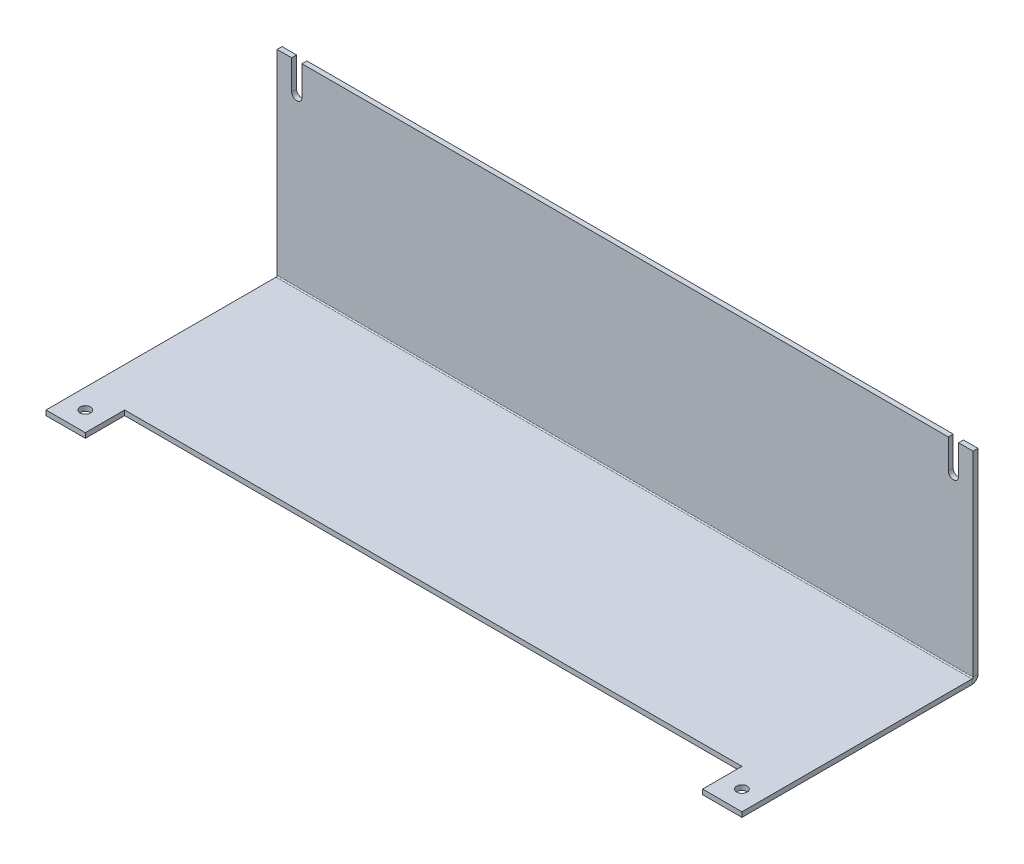
ISO-10303-21;
HEADER;
FILE_DESCRIPTION(('STEP AP214'),'2;1');
FILE_NAME('part.step','',(''),(''),'','','');
FILE_SCHEMA(('AUTOMOTIVE_DESIGN { 1 0 10303 214 1 1 1 1 }'));
ENDSEC;
DATA;
#1=APPLICATION_CONTEXT('core data for automotive mechanical design processes');
#2=APPLICATION_PROTOCOL_DEFINITION('international standard','automotive_design',2000,#1);
#3=PRODUCT_CONTEXT('',#1,'mechanical');
#4=PRODUCT('Part','Part','',(#3));
#5=PRODUCT_RELATED_PRODUCT_CATEGORY('part','',(#4));
#6=PRODUCT_DEFINITION_FORMATION('','',#4);
#7=PRODUCT_DEFINITION_CONTEXT('part definition',#1,'design');
#8=PRODUCT_DEFINITION('design','',#6,#7);
#9=PRODUCT_DEFINITION_SHAPE('','',#8);
#10=(LENGTH_UNIT() NAMED_UNIT(*) SI_UNIT(.MILLI.,.METRE.));
#11=(NAMED_UNIT(*) PLANE_ANGLE_UNIT() SI_UNIT($,.RADIAN.));
#12=(NAMED_UNIT(*) SI_UNIT($,.STERADIAN.) SOLID_ANGLE_UNIT());
#13=UNCERTAINTY_MEASURE_WITH_UNIT(LENGTH_MEASURE(1.E-05),#10,'distance_accuracy_value','');
#14=(GEOMETRIC_REPRESENTATION_CONTEXT(3) GLOBAL_UNCERTAINTY_ASSIGNED_CONTEXT((#13)) GLOBAL_UNIT_ASSIGNED_CONTEXT((#10,
#11,#12)) REPRESENTATION_CONTEXT('',''));
#15=CARTESIAN_POINT('',(0.,0.,0.));
#16=DIRECTION('',(0.,0.,1.));
#17=DIRECTION('',(1.,0.,0.));
#18=AXIS2_PLACEMENT_3D('',#15,#16,#17);
#19=CARTESIAN_POINT('',(0.,-3.175,0.));
#20=DIRECTION('',(0.,0.,1.));
#21=DIRECTION('',(1.,0.,0.));
#22=AXIS2_PLACEMENT_3D('',#19,#20,#21);
#23=PLANE('',#22);
#24=DIRECTION('',(1.,0.,0.));
#25=VECTOR('',#24,1.);
#26=CARTESIAN_POINT('',(0.,0.,0.));
#27=LINE('',#26,#25);
#28=CARTESIAN_POINT('',(25.4,0.,0.));
#29=VERTEX_POINT('',#28);
#30=CARTESIAN_POINT('',(423.926,0.,0.));
#31=VERTEX_POINT('',#30);
#32=EDGE_CURVE('E77',#29,#31,#27,.T.);
#33=ORIENTED_EDGE('',*,*,#32,.F.);
#34=DIRECTION('',(0.,1.,0.));
#35=VECTOR('',#34,1.);
#36=CARTESIAN_POINT('',(25.4,0.,0.));
#37=LINE('',#36,#35);
#38=CARTESIAN_POINT('',(25.4,-3.175,0.));
#39=VERTEX_POINT('',#38);
#40=EDGE_CURVE('E218',#39,#29,#37,.T.);
#41=ORIENTED_EDGE('',*,*,#40,.F.);
#42=DIRECTION('',(1.,0.,0.));
#43=VECTOR('',#42,1.);
#44=CARTESIAN_POINT('',(0.,-3.175,0.));
#45=LINE('',#44,#43);
#46=CARTESIAN_POINT('',(423.926,-3.175,0.));
#47=VERTEX_POINT('',#46);
#48=EDGE_CURVE('E203',#39,#47,#45,.T.);
#49=ORIENTED_EDGE('',*,*,#48,.T.);
#50=DIRECTION('',(0.,-1.,0.));
#51=VECTOR('',#50,1.);
#52=CARTESIAN_POINT('',(423.926,0.,0.));
#53=LINE('',#52,#51);
#54=EDGE_CURVE('E229',#31,#47,#53,.T.);
#55=ORIENTED_EDGE('',*,*,#54,.F.);
#56=EDGE_LOOP('',(#33,#41,#49,#55));
#57=FACE_BOUND('',#56,.T.);
#58=ADVANCED_FACE('F55',(#57),#23,.T.);
#59=CARTESIAN_POINT('',(449.326,127.,-127.));
#60=DIRECTION('',(0.,-1.,0.));
#61=DIRECTION('',(0.,0.,-1.));
#62=AXIS2_PLACEMENT_3D('',#59,#60,#61);
#63=PLANE('',#62);
#64=DIRECTION('',(1.,0.,0.));
#65=VECTOR('',#64,1.);
#66=CARTESIAN_POINT('',(0.,127.,-127.));
#67=LINE('',#66,#65);
#68=CARTESIAN_POINT('',(16.002,127.,-127.));
#69=VERTEX_POINT('',#68);
#70=CARTESIAN_POINT('',(433.324,127.,-127.));
#71=VERTEX_POINT('',#70);
#72=EDGE_CURVE('E285',#69,#71,#67,.T.);
#73=ORIENTED_EDGE('',*,*,#72,.F.);
#74=DIRECTION('',(0.,0.,1.));
#75=VECTOR('',#74,1.);
#76=CARTESIAN_POINT('',(16.002,127.,-127.));
#77=LINE('',#76,#75);
#78=CARTESIAN_POINT('',(16.002,127.,-123.825));
#79=VERTEX_POINT('',#78);
#80=EDGE_CURVE('E64',#69,#79,#77,.T.);
#81=ORIENTED_EDGE('',*,*,#80,.T.);
#82=DIRECTION('',(-1.,0.,0.));
#83=VECTOR('',#82,1.);
#84=CARTESIAN_POINT('',(449.326,127.,-123.825));
#85=LINE('',#84,#83);
#86=CARTESIAN_POINT('',(433.324,127.,-123.825));
#87=VERTEX_POINT('',#86);
#88=EDGE_CURVE('E283',#79,#87,#85,.F.);
#89=ORIENTED_EDGE('',*,*,#88,.T.);
#90=DIRECTION('',(0.,0.,-1.));
#91=VECTOR('',#90,1.);
#92=CARTESIAN_POINT('',(433.324,127.,-127.));
#93=LINE('',#92,#91);
#94=EDGE_CURVE('E267',#87,#71,#93,.T.);
#95=ORIENTED_EDGE('',*,*,#94,.T.);
#96=EDGE_LOOP('',(#73,#81,#89,#95));
#97=FACE_BOUND('',#96,.T.);
#98=ADVANCED_FACE('F282',(#97),#63,.F.);
#99=CARTESIAN_POINT('',(439.928,127.,-127.));
#100=VERTEX_POINT('',#99);
#101=CARTESIAN_POINT('',(449.326,127.,-127.));
#102=VERTEX_POINT('',#101);
#103=EDGE_CURVE('E434',#100,#102,#67,.T.);
#104=ORIENTED_EDGE('',*,*,#103,.F.);
#105=DIRECTION('',(0.,0.,1.));
#106=VECTOR('',#105,1.);
#107=CARTESIAN_POINT('',(439.928,127.,-127.));
#108=LINE('',#107,#106);
#109=CARTESIAN_POINT('',(439.928,127.,-123.825));
#110=VERTEX_POINT('',#109);
#111=EDGE_CURVE('E270',#100,#110,#108,.T.);
#112=ORIENTED_EDGE('',*,*,#111,.T.);
#113=CARTESIAN_POINT('',(449.326,127.,-123.825));
#114=VERTEX_POINT('',#113);
#115=EDGE_CURVE('E298',#110,#114,#85,.F.);
#116=ORIENTED_EDGE('',*,*,#115,.T.);
#117=DIRECTION('',(0.,0.,1.));
#118=VECTOR('',#117,1.);
#119=CARTESIAN_POINT('',(449.326,127.,-127.));
#120=LINE('',#119,#118);
#121=EDGE_CURVE('E430',#102,#114,#120,.T.);
#122=ORIENTED_EDGE('',*,*,#121,.F.);
#123=EDGE_LOOP('',(#104,#112,#116,#122));
#124=FACE_BOUND('',#123,.T.);
#125=ADVANCED_FACE('F376',(#124),#63,.F.);
#126=CARTESIAN_POINT('',(0.,-3.175,0.));
#127=DIRECTION('',(-1.,0.,0.));
#128=DIRECTION('',(0.,0.,1.));
#129=AXIS2_PLACEMENT_3D('',#126,#127,#128);
#130=PLANE('',#129);
#131=DIRECTION('',(0.,0.,1.));
#132=VECTOR('',#131,1.);
#133=CARTESIAN_POINT('',(0.,0.,0.));
#134=LINE('',#133,#132);
#135=CARTESIAN_POINT('',(0.,0.,-123.0884));
#136=VERTEX_POINT('',#135);
#137=CARTESIAN_POINT('',(0.,0.,25.4));
#138=VERTEX_POINT('',#137);
#139=EDGE_CURVE('E259',#136,#138,#134,.T.);
#140=ORIENTED_EDGE('',*,*,#139,.F.);
#141=DIRECTION('',(0.,-1.,0.));
#142=VECTOR('',#141,1.);
#143=CARTESIAN_POINT('',(0.,0.,-123.0884));
#144=LINE('',#143,#142);
#145=CARTESIAN_POINT('',(0.,-3.17500000000001,-123.0884));
#146=VERTEX_POINT('',#145);
#147=EDGE_CURVE('E200',#136,#146,#144,.T.);
#148=ORIENTED_EDGE('',*,*,#147,.T.);
#149=DIRECTION('',(0.,0.,1.));
#150=VECTOR('',#149,1.);
#151=CARTESIAN_POINT('',(0.,-3.175,0.));
#152=LINE('',#151,#150);
#153=CARTESIAN_POINT('',(0.,-3.175,25.4));
#154=VERTEX_POINT('',#153);
#155=EDGE_CURVE('E195',#146,#154,#152,.T.);
#156=ORIENTED_EDGE('',*,*,#155,.T.);
#157=DIRECTION('',(0.,-1.,0.));
#158=VECTOR('',#157,1.);
#159=CARTESIAN_POINT('',(0.,0.,25.4));
#160=LINE('',#159,#158);
#161=EDGE_CURVE('E199',#138,#154,#160,.T.);
#162=ORIENTED_EDGE('',*,*,#161,.F.);
#163=EDGE_LOOP('',(#140,#148,#156,#162));
#164=FACE_BOUND('',#163,.T.);
#165=ADVANCED_FACE('F57',(#164),#130,.T.);
#166=CARTESIAN_POINT('',(0.,-3.175,0.));
#167=DIRECTION('',(0.,-1.,0.));
#168=DIRECTION('',(0.,0.,-1.));
#169=AXIS2_PLACEMENT_3D('',#166,#167,#168);
#170=PLANE('',#169);
#171=CARTESIAN_POINT('',(12.7,-3.175,12.7));
#172=DIRECTION('',(0.,-1.,0.));
#173=DIRECTION('',(0.,0.,-1.));
#174=AXIS2_PLACEMENT_3D('',#171,#172,#173);
#175=CIRCLE('',#174,3.37819999999999);
#176=CARTESIAN_POINT('',(12.7,-3.175,9.32180000000002));
#177=VERTEX_POINT('',#176);
#178=EDGE_CURVE('E535',#177,#177,#175,.T.);
#179=ORIENTED_EDGE('',*,*,#178,.F.);
#180=EDGE_LOOP('',(#179));
#181=FACE_BOUND('',#180,.T.);
#182=CARTESIAN_POINT('',(436.626,-3.175,12.7));
#183=DIRECTION('',(0.,-1.,0.));
#184=DIRECTION('',(0.,0.,-1.));
#185=AXIS2_PLACEMENT_3D('',#182,#183,#184);
#186=CIRCLE('',#185,3.3782);
#187=CARTESIAN_POINT('',(436.626,-3.175,9.3218));
#188=VERTEX_POINT('',#187);
#189=EDGE_CURVE('E222',#188,#188,#186,.T.);
#190=ORIENTED_EDGE('',*,*,#189,.F.);
#191=EDGE_LOOP('',(#190));
#192=FACE_BOUND('',#191,.T.);
#193=ORIENTED_EDGE('',*,*,#155,.F.);
#194=DIRECTION('',(-1.,0.,0.));
#195=VECTOR('',#194,1.);
#196=CARTESIAN_POINT('',(0.,-3.17500000000001,-123.0884));
#197=LINE('',#196,#195);
#198=CARTESIAN_POINT('',(449.326,-3.175,-123.0884));
#199=VERTEX_POINT('',#198);
#200=EDGE_CURVE('E321',#146,#199,#197,.F.);
#201=ORIENTED_EDGE('',*,*,#200,.T.);
#202=DIRECTION('',(0.,0.,-1.));
#203=VECTOR('',#202,1.);
#204=CARTESIAN_POINT('',(449.326,-3.175,0.));
#205=LINE('',#204,#203);
#206=CARTESIAN_POINT('',(449.326,-3.175,25.4));
#207=VERTEX_POINT('',#206);
#208=EDGE_CURVE('E271',#207,#199,#205,.T.);
#209=ORIENTED_EDGE('',*,*,#208,.F.);
#210=DIRECTION('',(1.,0.,0.));
#211=VECTOR('',#210,1.);
#212=CARTESIAN_POINT('',(449.326,-3.175,25.4));
#213=LINE('',#212,#211);
#214=CARTESIAN_POINT('',(423.926,-3.175,25.4));
#215=VERTEX_POINT('',#214);
#216=EDGE_CURVE('E237',#215,#207,#213,.T.);
#217=ORIENTED_EDGE('',*,*,#216,.F.);
#218=DIRECTION('',(0.,0.,-1.));
#219=VECTOR('',#218,1.);
#220=CARTESIAN_POINT('',(423.926,-3.175,25.4));
#221=LINE('',#220,#219);
#222=EDGE_CURVE('E240',#215,#47,#221,.T.);
#223=ORIENTED_EDGE('',*,*,#222,.T.);
#224=ORIENTED_EDGE('',*,*,#48,.F.);
#225=DIRECTION('',(0.,0.,-1.));
#226=VECTOR('',#225,1.);
#227=CARTESIAN_POINT('',(25.4,-3.175,25.4));
#228=LINE('',#227,#226);
#229=CARTESIAN_POINT('',(25.4,-3.175,25.4));
#230=VERTEX_POINT('',#229);
#231=EDGE_CURVE('E210',#230,#39,#228,.T.);
#232=ORIENTED_EDGE('',*,*,#231,.F.);
#233=DIRECTION('',(1.,0.,0.));
#234=VECTOR('',#233,1.);
#235=CARTESIAN_POINT('',(0.,-3.175,25.4));
#236=LINE('',#235,#234);
#237=EDGE_CURVE('E207',#154,#230,#236,.T.);
#238=ORIENTED_EDGE('',*,*,#237,.F.);
#239=EDGE_LOOP('',(#193,#201,#209,#217,#223,#224,#232,#238));
#240=FACE_BOUND('',#239,.T.);
#241=ADVANCED_FACE('F208',(#181,#192,#240),#170,.T.);
#242=CARTESIAN_POINT('',(0.,0.,0.));
#243=DIRECTION('',(0.,-1.,0.));
#244=DIRECTION('',(0.,0.,-1.));
#245=AXIS2_PLACEMENT_3D('',#242,#243,#244);
#246=PLANE('',#245);
#247=CARTESIAN_POINT('',(12.7,0.,12.7));
#248=DIRECTION('',(0.,-1.,0.));
#249=DIRECTION('',(0.,0.,-1.));
#250=AXIS2_PLACEMENT_3D('',#247,#248,#249);
#251=CIRCLE('',#250,3.37819999999999);
#252=CARTESIAN_POINT('',(12.7,0.,9.32180000000002));
#253=VERTEX_POINT('',#252);
#254=EDGE_CURVE('E537',#253,#253,#251,.T.);
#255=ORIENTED_EDGE('',*,*,#254,.T.);
#256=EDGE_LOOP('',(#255));
#257=FACE_BOUND('',#256,.T.);
#258=CARTESIAN_POINT('',(436.626,0.,12.7));
#259=DIRECTION('',(0.,-1.,0.));
#260=DIRECTION('',(0.,0.,-1.));
#261=AXIS2_PLACEMENT_3D('',#258,#259,#260);
#262=CIRCLE('',#261,3.3782);
#263=CARTESIAN_POINT('',(436.626,0.,9.3218));
#264=VERTEX_POINT('',#263);
#265=EDGE_CURVE('E59',#264,#264,#262,.T.);
#266=ORIENTED_EDGE('',*,*,#265,.T.);
#267=EDGE_LOOP('',(#266));
#268=FACE_BOUND('',#267,.T.);
#269=DIRECTION('',(-1.,0.,0.));
#270=VECTOR('',#269,1.);
#271=CARTESIAN_POINT('',(0.,0.,-123.0884));
#272=LINE('',#271,#270);
#273=CARTESIAN_POINT('',(449.326,0.,-123.0884));
#274=VERTEX_POINT('',#273);
#275=EDGE_CURVE('E332',#136,#274,#272,.F.);
#276=ORIENTED_EDGE('',*,*,#275,.F.);
#277=ORIENTED_EDGE('',*,*,#139,.T.);
#278=DIRECTION('',(-1.,0.,0.));
#279=VECTOR('',#278,1.);
#280=CARTESIAN_POINT('',(0.,0.,25.4));
#281=LINE('',#280,#279);
#282=CARTESIAN_POINT('',(25.4,0.,25.4));
#283=VERTEX_POINT('',#282);
#284=EDGE_CURVE('E217',#283,#138,#281,.T.);
#285=ORIENTED_EDGE('',*,*,#284,.F.);
#286=DIRECTION('',(0.,0.,-1.));
#287=VECTOR('',#286,1.);
#288=CARTESIAN_POINT('',(25.4,0.,25.4));
#289=LINE('',#288,#287);
#290=EDGE_CURVE('E72',#283,#29,#289,.T.);
#291=ORIENTED_EDGE('',*,*,#290,.T.);
#292=ORIENTED_EDGE('',*,*,#32,.T.);
#293=DIRECTION('',(0.,0.,-1.));
#294=VECTOR('',#293,1.);
#295=CARTESIAN_POINT('',(423.926,0.,25.4));
#296=LINE('',#295,#294);
#297=CARTESIAN_POINT('',(423.926,0.,25.4));
#298=VERTEX_POINT('',#297);
#299=EDGE_CURVE('E251',#298,#31,#296,.T.);
#300=ORIENTED_EDGE('',*,*,#299,.F.);
#301=DIRECTION('',(-1.,0.,0.));
#302=VECTOR('',#301,1.);
#303=CARTESIAN_POINT('',(449.326,0.,25.4));
#304=LINE('',#303,#302);
#305=CARTESIAN_POINT('',(449.326,0.,25.4));
#306=VERTEX_POINT('',#305);
#307=EDGE_CURVE('E233',#306,#298,#304,.T.);
#308=ORIENTED_EDGE('',*,*,#307,.F.);
#309=DIRECTION('',(0.,0.,-1.));
#310=VECTOR('',#309,1.);
#311=CARTESIAN_POINT('',(449.326,0.,0.));
#312=LINE('',#311,#310);
#313=EDGE_CURVE('E204',#306,#274,#312,.T.);
#314=ORIENTED_EDGE('',*,*,#313,.T.);
#315=EDGE_LOOP('',(#276,#277,#285,#291,#292,#300,#308,#314));
#316=FACE_BOUND('',#315,.T.);
#317=ADVANCED_FACE('F358',(#257,#268,#316),#246,.F.);
#318=CARTESIAN_POINT('',(449.326,-3.175,0.));
#319=DIRECTION('',(1.,0.,0.));
#320=DIRECTION('',(0.,0.,-1.));
#321=AXIS2_PLACEMENT_3D('',#318,#319,#320);
#322=PLANE('',#321);
#323=DIRECTION('',(0.,-1.,0.));
#324=VECTOR('',#323,1.);
#325=CARTESIAN_POINT('',(449.326,0.,-123.0884));
#326=LINE('',#325,#324);
#327=EDGE_CURVE('E338',#274,#199,#326,.T.);
#328=ORIENTED_EDGE('',*,*,#327,.F.);
#329=ORIENTED_EDGE('',*,*,#313,.F.);
#330=DIRECTION('',(0.,1.,0.));
#331=VECTOR('',#330,1.);
#332=CARTESIAN_POINT('',(449.326,0.,25.4));
#333=LINE('',#332,#331);
#334=EDGE_CURVE('E230',#207,#306,#333,.T.);
#335=ORIENTED_EDGE('',*,*,#334,.F.);
#336=ORIENTED_EDGE('',*,*,#208,.T.);
#337=EDGE_LOOP('',(#328,#329,#335,#336));
#338=FACE_BOUND('',#337,.T.);
#339=ADVANCED_FACE('F355',(#338),#322,.T.);
#340=CARTESIAN_POINT('',(449.326,0.736599999999999,-123.0884));
#341=DIRECTION('',(1.,0.,0.));
#342=DIRECTION('',(0.,0.,-1.));
#343=AXIS2_PLACEMENT_3D('',#340,#341,#342);
#344=PLANE('',#343);
#345=DIRECTION('',(0.,0.,1.));
#346=VECTOR('',#345,1.);
#347=CARTESIAN_POINT('',(449.326,0.736600000000026,-127.));
#348=LINE('',#347,#346);
#349=CARTESIAN_POINT('',(449.326,0.736599999999996,-123.825));
#350=VERTEX_POINT('',#349);
#351=CARTESIAN_POINT('',(449.326,0.736599999999985,-127.));
#352=VERTEX_POINT('',#351);
#353=EDGE_CURVE('E317',#350,#352,#348,.F.);
#354=ORIENTED_EDGE('',*,*,#353,.F.);
#355=CARTESIAN_POINT('',(449.326,0.736599999999999,-123.0884));
#356=DIRECTION('',(-1.,0.,0.));
#357=DIRECTION('',(0.,0.,1.));
#358=AXIS2_PLACEMENT_3D('',#355,#356,#357);
#359=CIRCLE('',#358,0.736600000000004);
#360=EDGE_CURVE('E329',#274,#350,#359,.F.);
#361=ORIENTED_EDGE('',*,*,#360,.F.);
#362=ORIENTED_EDGE('',*,*,#327,.T.);
#363=CARTESIAN_POINT('',(449.326,0.736599999999999,-123.0884));
#364=DIRECTION('',(-1.,0.,0.));
#365=DIRECTION('',(0.,0.,1.));
#366=AXIS2_PLACEMENT_3D('',#363,#364,#365);
#367=CIRCLE('',#366,3.9116);
#368=EDGE_CURVE('E323',#199,#352,#367,.F.);
#369=ORIENTED_EDGE('',*,*,#368,.T.);
#370=EDGE_LOOP('',(#354,#361,#362,#369));
#371=FACE_BOUND('',#370,.T.);
#372=ADVANCED_FACE('F366',(#371),#344,.T.);
#373=CARTESIAN_POINT('',(0.,0.736599999999999,-123.0884));
#374=DIRECTION('',(1.,0.,0.));
#375=DIRECTION('',(0.,0.,-1.));
#376=AXIS2_PLACEMENT_3D('',#373,#374,#375);
#377=PLANE('',#376);
#378=CARTESIAN_POINT('',(0.,0.736599999999999,-123.0884));
#379=DIRECTION('',(-1.,0.,0.));
#380=DIRECTION('',(0.,0.,1.));
#381=AXIS2_PLACEMENT_3D('',#378,#379,#380);
#382=CIRCLE('',#381,0.736600000000004);
#383=CARTESIAN_POINT('',(0.,0.736599999999996,-123.825));
#384=VERTEX_POINT('',#383);
#385=EDGE_CURVE('E334',#384,#136,#382,.T.);
#386=ORIENTED_EDGE('',*,*,#385,.F.);
#387=DIRECTION('',(0.,0.,1.));
#388=VECTOR('',#387,1.);
#389=CARTESIAN_POINT('',(0.,0.736600000000004,-123.825));
#390=LINE('',#389,#388);
#391=CARTESIAN_POINT('',(0.,0.736600000000026,-127.));
#392=VERTEX_POINT('',#391);
#393=EDGE_CURVE('E312',#384,#392,#390,.F.);
#394=ORIENTED_EDGE('',*,*,#393,.T.);
#395=CARTESIAN_POINT('',(0.,0.736599999999999,-123.0884));
#396=DIRECTION('',(-1.,0.,0.));
#397=DIRECTION('',(0.,0.,1.));
#398=AXIS2_PLACEMENT_3D('',#395,#396,#397);
#399=CIRCLE('',#398,3.9116);
#400=EDGE_CURVE('E324',#392,#146,#399,.T.);
#401=ORIENTED_EDGE('',*,*,#400,.T.);
#402=ORIENTED_EDGE('',*,*,#147,.F.);
#403=EDGE_LOOP('',(#386,#394,#401,#402));
#404=FACE_BOUND('',#403,.T.);
#405=ADVANCED_FACE('F489',(#404),#377,.F.);
#406=CARTESIAN_POINT('',(0.,0.736599999999999,-123.0884));
#407=DIRECTION('',(-1.,0.,0.));
#408=DIRECTION('',(0.,0.,-1.));
#409=AXIS2_PLACEMENT_3D('',#406,#407,#408);
#410=CYLINDRICAL_SURFACE('',#409,3.9116);
#411=ORIENTED_EDGE('',*,*,#200,.F.);
#412=ORIENTED_EDGE('',*,*,#400,.F.);
#413=DIRECTION('',(-1.,0.,0.));
#414=VECTOR('',#413,1.);
#415=CARTESIAN_POINT('',(449.326,0.736600000000026,-127.));
#416=LINE('',#415,#414);
#417=EDGE_CURVE('E310',#392,#352,#416,.F.);
#418=ORIENTED_EDGE('',*,*,#417,.T.);
#419=ORIENTED_EDGE('',*,*,#368,.F.);
#420=EDGE_LOOP('',(#411,#412,#418,#419));
#421=FACE_BOUND('',#420,.T.);
#422=ADVANCED_FACE('F486',(#421),#410,.T.);
#423=CARTESIAN_POINT('',(0.,0.736599999999999,-123.0884));
#424=DIRECTION('',(-1.,0.,0.));
#425=DIRECTION('',(0.,0.,-1.));
#426=AXIS2_PLACEMENT_3D('',#423,#424,#425);
#427=CYLINDRICAL_SURFACE('',#426,0.736600000000004);
#428=ORIENTED_EDGE('',*,*,#275,.T.);
#429=ORIENTED_EDGE('',*,*,#360,.T.);
#430=DIRECTION('',(-1.,0.,0.));
#431=VECTOR('',#430,1.);
#432=CARTESIAN_POINT('',(449.326,0.736600000000004,-123.825));
#433=LINE('',#432,#431);
#434=EDGE_CURVE('E315',#350,#384,#433,.T.);
#435=ORIENTED_EDGE('',*,*,#434,.T.);
#436=ORIENTED_EDGE('',*,*,#385,.T.);
#437=EDGE_LOOP('',(#428,#429,#435,#436));
#438=FACE_BOUND('',#437,.T.);
#439=ADVANCED_FACE('F451',(#438),#427,.F.);
#440=CARTESIAN_POINT('',(449.326,0.,-127.));
#441=DIRECTION('',(-1.,0.,0.));
#442=DIRECTION('',(0.,0.,1.));
#443=AXIS2_PLACEMENT_3D('',#440,#441,#442);
#444=PLANE('',#443);
#445=ORIENTED_EDGE('',*,*,#353,.T.);
#446=DIRECTION('',(0.,-1.,0.));
#447=VECTOR('',#446,1.);
#448=CARTESIAN_POINT('',(449.326,-4.5517466310089E-13,-127.));
#449=LINE('',#448,#447);
#450=EDGE_CURVE('E301',#102,#352,#449,.T.);
#451=ORIENTED_EDGE('',*,*,#450,.F.);
#452=ORIENTED_EDGE('',*,*,#121,.T.);
#453=DIRECTION('',(0.,1.,0.));
#454=VECTOR('',#453,1.);
#455=CARTESIAN_POINT('',(449.326,0.,-123.825));
#456=LINE('',#455,#454);
#457=EDGE_CURVE('E307',#114,#350,#456,.F.);
#458=ORIENTED_EDGE('',*,*,#457,.T.);
#459=EDGE_LOOP('',(#445,#451,#452,#458));
#460=FACE_BOUND('',#459,.T.);
#461=ADVANCED_FACE('F446',(#460),#444,.F.);
#462=CARTESIAN_POINT('',(0.,127.,-127.));
#463=DIRECTION('',(1.,0.,0.));
#464=DIRECTION('',(0.,0.,-1.));
#465=AXIS2_PLACEMENT_3D('',#462,#463,#464);
#466=PLANE('',#465);
#467=ORIENTED_EDGE('',*,*,#393,.F.);
#468=DIRECTION('',(0.,-1.,0.));
#469=VECTOR('',#468,1.);
#470=CARTESIAN_POINT('',(0.,127.,-123.825));
#471=LINE('',#470,#469);
#472=CARTESIAN_POINT('',(0.,127.,-123.825));
#473=VERTEX_POINT('',#472);
#474=EDGE_CURVE('E302',#384,#473,#471,.F.);
#475=ORIENTED_EDGE('',*,*,#474,.T.);
#476=DIRECTION('',(0.,0.,1.));
#477=VECTOR('',#476,1.);
#478=CARTESIAN_POINT('',(0.,127.,-127.));
#479=LINE('',#478,#477);
#480=CARTESIAN_POINT('',(0.,127.,-127.));
#481=VERTEX_POINT('',#480);
#482=EDGE_CURVE('E337',#481,#473,#479,.T.);
#483=ORIENTED_EDGE('',*,*,#482,.F.);
#484=DIRECTION('',(0.,1.,0.));
#485=VECTOR('',#484,1.);
#486=CARTESIAN_POINT('',(0.,-4.5517466310089E-13,-127.));
#487=LINE('',#486,#485);
#488=EDGE_CURVE('E435',#392,#481,#487,.T.);
#489=ORIENTED_EDGE('',*,*,#488,.F.);
#490=EDGE_LOOP('',(#467,#475,#483,#489));
#491=FACE_BOUND('',#490,.T.);
#492=ADVANCED_FACE('F475',(#491),#466,.F.);
#493=CARTESIAN_POINT('',(0.,-4.5517466310089E-13,-127.));
#494=DIRECTION('',(0.,0.,1.));
#495=DIRECTION('',(0.,-1.,0.));
#496=AXIS2_PLACEMENT_3D('',#493,#494,#495);
#497=PLANE('',#496);
#498=CARTESIAN_POINT('',(12.7,107.95,-127.));
#499=DIRECTION('',(0.,0.,-1.));
#500=DIRECTION('',(0.,1.,0.));
#501=AXIS2_PLACEMENT_3D('',#498,#499,#500);
#502=CIRCLE('',#501,3.302);
#503=CARTESIAN_POINT('',(16.002,107.95,-127.));
#504=VERTEX_POINT('',#503);
#505=CARTESIAN_POINT('',(9.39799999999999,107.95,-127.));
#506=VERTEX_POINT('',#505);
#507=EDGE_CURVE('E243',#504,#506,#502,.T.);
#508=ORIENTED_EDGE('',*,*,#507,.F.);
#509=DIRECTION('',(0.,-1.,0.));
#510=VECTOR('',#509,1.);
#511=CARTESIAN_POINT('',(16.002,107.95,-127.));
#512=LINE('',#511,#510);
#513=EDGE_CURVE('E502',#69,#504,#512,.T.);
#514=ORIENTED_EDGE('',*,*,#513,.F.);
#515=ORIENTED_EDGE('',*,*,#72,.T.);
#516=DIRECTION('',(0.,1.,0.));
#517=VECTOR('',#516,1.);
#518=CARTESIAN_POINT('',(433.324,107.95,-127.));
#519=LINE('',#518,#517);
#520=CARTESIAN_POINT('',(433.324,107.95,-127.));
#521=VERTEX_POINT('',#520);
#522=EDGE_CURVE('E417',#521,#71,#519,.T.);
#523=ORIENTED_EDGE('',*,*,#522,.F.);
#524=CARTESIAN_POINT('',(436.626,107.95,-127.));
#525=DIRECTION('',(0.,0.,-1.));
#526=DIRECTION('',(0.,1.,0.));
#527=AXIS2_PLACEMENT_3D('',#524,#525,#526);
#528=CIRCLE('',#527,3.302);
#529=CARTESIAN_POINT('',(439.928,107.95,-127.));
#530=VERTEX_POINT('',#529);
#531=EDGE_CURVE('E409',#530,#521,#528,.T.);
#532=ORIENTED_EDGE('',*,*,#531,.F.);
#533=DIRECTION('',(0.,-1.,0.));
#534=VECTOR('',#533,1.);
#535=CARTESIAN_POINT('',(439.928,107.95,-127.));
#536=LINE('',#535,#534);
#537=EDGE_CURVE('E420',#100,#530,#536,.T.);
#538=ORIENTED_EDGE('',*,*,#537,.F.);
#539=ORIENTED_EDGE('',*,*,#103,.T.);
#540=ORIENTED_EDGE('',*,*,#450,.T.);
#541=ORIENTED_EDGE('',*,*,#417,.F.);
#542=ORIENTED_EDGE('',*,*,#488,.T.);
#543=CARTESIAN_POINT('',(9.39799999999996,127.,-127.));
#544=VERTEX_POINT('',#543);
#545=EDGE_CURVE('E433',#481,#544,#67,.T.);
#546=ORIENTED_EDGE('',*,*,#545,.T.);
#547=DIRECTION('',(0.,1.,0.));
#548=VECTOR('',#547,1.);
#549=CARTESIAN_POINT('',(9.398,127.,-127.));
#550=LINE('',#549,#548);
#551=EDGE_CURVE('E500',#506,#544,#550,.T.);
#552=ORIENTED_EDGE('',*,*,#551,.F.);
#553=EDGE_LOOP('',(#508,#514,#515,#523,#532,#538,#539,#540,#541,#542,#546,#552));
#554=FACE_BOUND('',#553,.T.);
#555=ADVANCED_FACE('F395',(#554),#497,.F.);
#556=CARTESIAN_POINT('',(0.,-4.44089209850063E-13,-123.825));
#557=DIRECTION('',(0.,0.,1.));
#558=DIRECTION('',(0.,-1.,0.));
#559=AXIS2_PLACEMENT_3D('',#556,#557,#558);
#560=PLANE('',#559);
#561=DIRECTION('',(0.,1.,0.));
#562=VECTOR('',#561,1.);
#563=CARTESIAN_POINT('',(16.002,-4.44089209850063E-13,-123.825));
#564=LINE('',#563,#562);
#565=CARTESIAN_POINT('',(16.002,107.95,-123.825));
#566=VERTEX_POINT('',#565);
#567=EDGE_CURVE('E294',#566,#79,#564,.T.);
#568=ORIENTED_EDGE('',*,*,#567,.F.);
#569=CARTESIAN_POINT('',(12.7,107.95,-123.825));
#570=DIRECTION('',(0.,0.,1.));
#571=DIRECTION('',(0.,-1.,0.));
#572=AXIS2_PLACEMENT_3D('',#569,#570,#571);
#573=CIRCLE('',#572,3.302);
#574=CARTESIAN_POINT('',(9.39799999999999,107.95,-123.825));
#575=VERTEX_POINT('',#574);
#576=EDGE_CURVE('E13',#575,#566,#573,.T.);
#577=ORIENTED_EDGE('',*,*,#576,.F.);
#578=DIRECTION('',(0.,-1.,0.));
#579=VECTOR('',#578,1.);
#580=CARTESIAN_POINT('',(9.39799999999997,-4.45800803679693E-13,-123.825));
#581=LINE('',#580,#579);
#582=CARTESIAN_POINT('',(9.398,127.,-123.825));
#583=VERTEX_POINT('',#582);
#584=EDGE_CURVE('E404',#583,#575,#581,.T.);
#585=ORIENTED_EDGE('',*,*,#584,.F.);
#586=EDGE_CURVE('E297',#473,#583,#85,.F.);
#587=ORIENTED_EDGE('',*,*,#586,.F.);
#588=ORIENTED_EDGE('',*,*,#474,.F.);
#589=ORIENTED_EDGE('',*,*,#434,.F.);
#590=ORIENTED_EDGE('',*,*,#457,.F.);
#591=ORIENTED_EDGE('',*,*,#115,.F.);
#592=DIRECTION('',(0.,1.,0.));
#593=VECTOR('',#592,1.);
#594=CARTESIAN_POINT('',(439.928,-4.44089209850063E-13,-123.825));
#595=LINE('',#594,#593);
#596=CARTESIAN_POINT('',(439.928,107.95,-123.825));
#597=VERTEX_POINT('',#596);
#598=EDGE_CURVE('E320',#597,#110,#595,.T.);
#599=ORIENTED_EDGE('',*,*,#598,.F.);
#600=CARTESIAN_POINT('',(436.626,107.95,-123.825));
#601=DIRECTION('',(0.,0.,1.));
#602=DIRECTION('',(0.,-1.,0.));
#603=AXIS2_PLACEMENT_3D('',#600,#601,#602);
#604=CIRCLE('',#603,3.302);
#605=CARTESIAN_POINT('',(433.324,107.95,-123.825));
#606=VERTEX_POINT('',#605);
#607=EDGE_CURVE('E274',#606,#597,#604,.T.);
#608=ORIENTED_EDGE('',*,*,#607,.F.);
#609=DIRECTION('',(0.,-1.,0.));
#610=VECTOR('',#609,1.);
#611=CARTESIAN_POINT('',(433.324,-4.44089209850063E-13,-123.825));
#612=LINE('',#611,#610);
#613=EDGE_CURVE('E296',#87,#606,#612,.T.);
#614=ORIENTED_EDGE('',*,*,#613,.F.);
#615=ORIENTED_EDGE('',*,*,#88,.F.);
#616=EDGE_LOOP('',(#568,#577,#585,#587,#588,#589,#590,#591,#599,#608,#614,#615));
#617=FACE_BOUND('',#616,.T.);
#618=ADVANCED_FACE('F292',(#617),#560,.T.);
#619=ORIENTED_EDGE('',*,*,#586,.T.);
#620=DIRECTION('',(0.,0.,-1.));
#621=VECTOR('',#620,1.);
#622=CARTESIAN_POINT('',(9.39800000000002,127.,-127.));
#623=LINE('',#622,#621);
#624=EDGE_CURVE('E276',#583,#544,#623,.T.);
#625=ORIENTED_EDGE('',*,*,#624,.T.);
#626=ORIENTED_EDGE('',*,*,#545,.F.);
#627=ORIENTED_EDGE('',*,*,#482,.T.);
#628=EDGE_LOOP('',(#619,#625,#626,#627));
#629=FACE_BOUND('',#628,.T.);
#630=ADVANCED_FACE('F378',(#629),#63,.F.);
#631=CARTESIAN_POINT('',(436.626,107.95,0.));
#632=DIRECTION('',(0.,0.,-1.));
#633=DIRECTION('',(0.,1.,0.));
#634=AXIS2_PLACEMENT_3D('',#631,#632,#633);
#635=CYLINDRICAL_SURFACE('',#634,3.302);
#636=ORIENTED_EDGE('',*,*,#607,.T.);
#637=DIRECTION('',(0.,0.,-1.));
#638=VECTOR('',#637,1.);
#639=CARTESIAN_POINT('',(439.928,107.95,0.));
#640=LINE('',#639,#638);
#641=EDGE_CURVE('E424',#597,#530,#640,.T.);
#642=ORIENTED_EDGE('',*,*,#641,.T.);
#643=ORIENTED_EDGE('',*,*,#531,.T.);
#644=DIRECTION('',(0.,0.,-1.));
#645=VECTOR('',#644,1.);
#646=CARTESIAN_POINT('',(433.324,107.95,0.));
#647=LINE('',#646,#645);
#648=EDGE_CURVE('E423',#606,#521,#647,.T.);
#649=ORIENTED_EDGE('',*,*,#648,.F.);
#650=EDGE_LOOP('',(#636,#642,#643,#649));
#651=FACE_BOUND('',#650,.T.);
#652=ADVANCED_FACE('F386',(#651),#635,.F.);
#653=CARTESIAN_POINT('',(439.928,107.95,0.));
#654=DIRECTION('',(1.,0.,0.));
#655=DIRECTION('',(0.,0.,-1.));
#656=AXIS2_PLACEMENT_3D('',#653,#654,#655);
#657=PLANE('',#656);
#658=ORIENTED_EDGE('',*,*,#598,.T.);
#659=ORIENTED_EDGE('',*,*,#111,.F.);
#660=ORIENTED_EDGE('',*,*,#537,.T.);
#661=ORIENTED_EDGE('',*,*,#641,.F.);
#662=EDGE_LOOP('',(#658,#659,#660,#661));
#663=FACE_BOUND('',#662,.T.);
#664=ADVANCED_FACE('F392',(#663),#657,.F.);
#665=CARTESIAN_POINT('',(433.324,107.95,0.));
#666=DIRECTION('',(-1.,0.,0.));
#667=DIRECTION('',(0.,0.,1.));
#668=AXIS2_PLACEMENT_3D('',#665,#666,#667);
#669=PLANE('',#668);
#670=ORIENTED_EDGE('',*,*,#613,.T.);
#671=ORIENTED_EDGE('',*,*,#648,.T.);
#672=ORIENTED_EDGE('',*,*,#522,.T.);
#673=ORIENTED_EDGE('',*,*,#94,.F.);
#674=EDGE_LOOP('',(#670,#671,#672,#673));
#675=FACE_BOUND('',#674,.T.);
#676=ADVANCED_FACE('F461',(#675),#669,.F.);
#677=CARTESIAN_POINT('',(12.7,107.95,0.));
#678=DIRECTION('',(0.,0.,-1.));
#679=DIRECTION('',(0.,1.,0.));
#680=AXIS2_PLACEMENT_3D('',#677,#678,#679);
#681=CYLINDRICAL_SURFACE('',#680,3.302);
#682=ORIENTED_EDGE('',*,*,#576,.T.);
#683=DIRECTION('',(0.,0.,-1.));
#684=VECTOR('',#683,1.);
#685=CARTESIAN_POINT('',(16.002,107.95,0.));
#686=LINE('',#685,#684);
#687=EDGE_CURVE('E407',#566,#504,#686,.T.);
#688=ORIENTED_EDGE('',*,*,#687,.T.);
#689=ORIENTED_EDGE('',*,*,#507,.T.);
#690=DIRECTION('',(0.,0.,-1.));
#691=VECTOR('',#690,1.);
#692=CARTESIAN_POINT('',(9.39799999999999,107.95,0.));
#693=LINE('',#692,#691);
#694=EDGE_CURVE('E411',#575,#506,#693,.T.);
#695=ORIENTED_EDGE('',*,*,#694,.F.);
#696=EDGE_LOOP('',(#682,#688,#689,#695));
#697=FACE_BOUND('',#696,.T.);
#698=ADVANCED_FACE('F463',(#697),#681,.F.);
#699=CARTESIAN_POINT('',(16.002,107.95,0.));
#700=DIRECTION('',(1.,0.,0.));
#701=DIRECTION('',(0.,0.,-1.));
#702=AXIS2_PLACEMENT_3D('',#699,#700,#701);
#703=PLANE('',#702);
#704=ORIENTED_EDGE('',*,*,#567,.T.);
#705=ORIENTED_EDGE('',*,*,#80,.F.);
#706=ORIENTED_EDGE('',*,*,#513,.T.);
#707=ORIENTED_EDGE('',*,*,#687,.F.);
#708=EDGE_LOOP('',(#704,#705,#706,#707));
#709=FACE_BOUND('',#708,.T.);
#710=ADVANCED_FACE('F469',(#709),#703,.F.);
#711=CARTESIAN_POINT('',(9.398,127.,0.));
#712=DIRECTION('',(-1.,0.,0.));
#713=DIRECTION('',(0.,-1.,0.));
#714=AXIS2_PLACEMENT_3D('',#711,#712,#713);
#715=PLANE('',#714);
#716=ORIENTED_EDGE('',*,*,#584,.T.);
#717=ORIENTED_EDGE('',*,*,#694,.T.);
#718=ORIENTED_EDGE('',*,*,#551,.T.);
#719=ORIENTED_EDGE('',*,*,#624,.F.);
#720=EDGE_LOOP('',(#716,#717,#718,#719));
#721=FACE_BOUND('',#720,.T.);
#722=ADVANCED_FACE('F506',(#721),#715,.F.);
#723=CARTESIAN_POINT('',(423.926,0.,25.4));
#724=DIRECTION('',(1.,0.,0.));
#725=DIRECTION('',(0.,0.,-1.));
#726=AXIS2_PLACEMENT_3D('',#723,#724,#725);
#727=PLANE('',#726);
#728=ORIENTED_EDGE('',*,*,#54,.T.);
#729=ORIENTED_EDGE('',*,*,#222,.F.);
#730=DIRECTION('',(0.,-1.,0.));
#731=VECTOR('',#730,1.);
#732=CARTESIAN_POINT('',(423.926,0.,25.4));
#733=LINE('',#732,#731);
#734=EDGE_CURVE('E235',#298,#215,#733,.T.);
#735=ORIENTED_EDGE('',*,*,#734,.F.);
#736=ORIENTED_EDGE('',*,*,#299,.T.);
#737=EDGE_LOOP('',(#728,#729,#735,#736));
#738=FACE_BOUND('',#737,.T.);
#739=ADVANCED_FACE('F350',(#738),#727,.F.);
#740=CARTESIAN_POINT('',(0.,0.,25.4));
#741=DIRECTION('',(0.,0.,-1.));
#742=DIRECTION('',(-1.,0.,0.));
#743=AXIS2_PLACEMENT_3D('',#740,#741,#742);
#744=PLANE('',#743);
#745=ORIENTED_EDGE('',*,*,#334,.T.);
#746=ORIENTED_EDGE('',*,*,#307,.T.);
#747=ORIENTED_EDGE('',*,*,#734,.T.);
#748=ORIENTED_EDGE('',*,*,#216,.T.);
#749=EDGE_LOOP('',(#745,#746,#747,#748));
#750=FACE_BOUND('',#749,.T.);
#751=ADVANCED_FACE('F354',(#750),#744,.F.);
#752=CARTESIAN_POINT('',(25.4,0.,25.4));
#753=DIRECTION('',(-1.,0.,0.));
#754=DIRECTION('',(0.,0.,1.));
#755=AXIS2_PLACEMENT_3D('',#752,#753,#754);
#756=PLANE('',#755);
#757=ORIENTED_EDGE('',*,*,#40,.T.);
#758=ORIENTED_EDGE('',*,*,#290,.F.);
#759=DIRECTION('',(0.,1.,0.));
#760=VECTOR('',#759,1.);
#761=CARTESIAN_POINT('',(25.4,0.,25.4));
#762=LINE('',#761,#760);
#763=EDGE_CURVE('E213',#230,#283,#762,.T.);
#764=ORIENTED_EDGE('',*,*,#763,.F.);
#765=ORIENTED_EDGE('',*,*,#231,.T.);
#766=EDGE_LOOP('',(#757,#758,#764,#765));
#767=FACE_BOUND('',#766,.T.);
#768=ADVANCED_FACE('F517',(#767),#756,.F.);
#769=CARTESIAN_POINT('',(0.,0.,25.4));
#770=DIRECTION('',(0.,0.,1.));
#771=DIRECTION('',(1.,0.,0.));
#772=AXIS2_PLACEMENT_3D('',#769,#770,#771);
#773=PLANE('',#772);
#774=ORIENTED_EDGE('',*,*,#161,.T.);
#775=ORIENTED_EDGE('',*,*,#237,.T.);
#776=ORIENTED_EDGE('',*,*,#763,.T.);
#777=ORIENTED_EDGE('',*,*,#284,.T.);
#778=EDGE_LOOP('',(#774,#775,#776,#777));
#779=FACE_BOUND('',#778,.T.);
#780=ADVANCED_FACE('F216',(#779),#773,.T.);
#781=CARTESIAN_POINT('',(436.626,-3.175,12.7));
#782=DIRECTION('',(0.,-1.,0.));
#783=DIRECTION('',(0.,0.,-1.));
#784=AXIS2_PLACEMENT_3D('',#781,#782,#783);
#785=CYLINDRICAL_SURFACE('',#784,3.3782);
#786=ORIENTED_EDGE('',*,*,#189,.T.);
#787=EDGE_LOOP('',(#786));
#788=FACE_BOUND('',#787,.T.);
#789=ORIENTED_EDGE('',*,*,#265,.F.);
#790=EDGE_LOOP('',(#789));
#791=FACE_BOUND('',#790,.T.);
#792=ADVANCED_FACE('F523',(#788,#791),#785,.F.);
#793=CARTESIAN_POINT('',(12.7,-3.175,12.7));
#794=DIRECTION('',(0.,-1.,0.));
#795=DIRECTION('',(0.,0.,-1.));
#796=AXIS2_PLACEMENT_3D('',#793,#794,#795);
#797=CYLINDRICAL_SURFACE('',#796,3.37819999999999);
#798=ORIENTED_EDGE('',*,*,#178,.T.);
#799=EDGE_LOOP('',(#798));
#800=FACE_BOUND('',#799,.T.);
#801=ORIENTED_EDGE('',*,*,#254,.F.);
#802=EDGE_LOOP('',(#801));
#803=FACE_BOUND('',#802,.T.);
#804=ADVANCED_FACE('F526',(#800,#803),#797,.F.);
#805=CLOSED_SHELL('',(#58,#98,#125,#165,#241,#317,#339,#372,#405,#422,#439,#461,#492,#555,#618,
#630,#652,#664,#676,#698,#710,#722,#739,#751,#768,#780,#792,#804));
#806=MANIFOLD_SOLID_BREP('B2',#805);
#807=ADVANCED_BREP_SHAPE_REPRESENTATION('',(#18,#806),#14);
#808=SHAPE_DEFINITION_REPRESENTATION(#9,#807);
ENDSEC;
END-ISO-10303-21;
